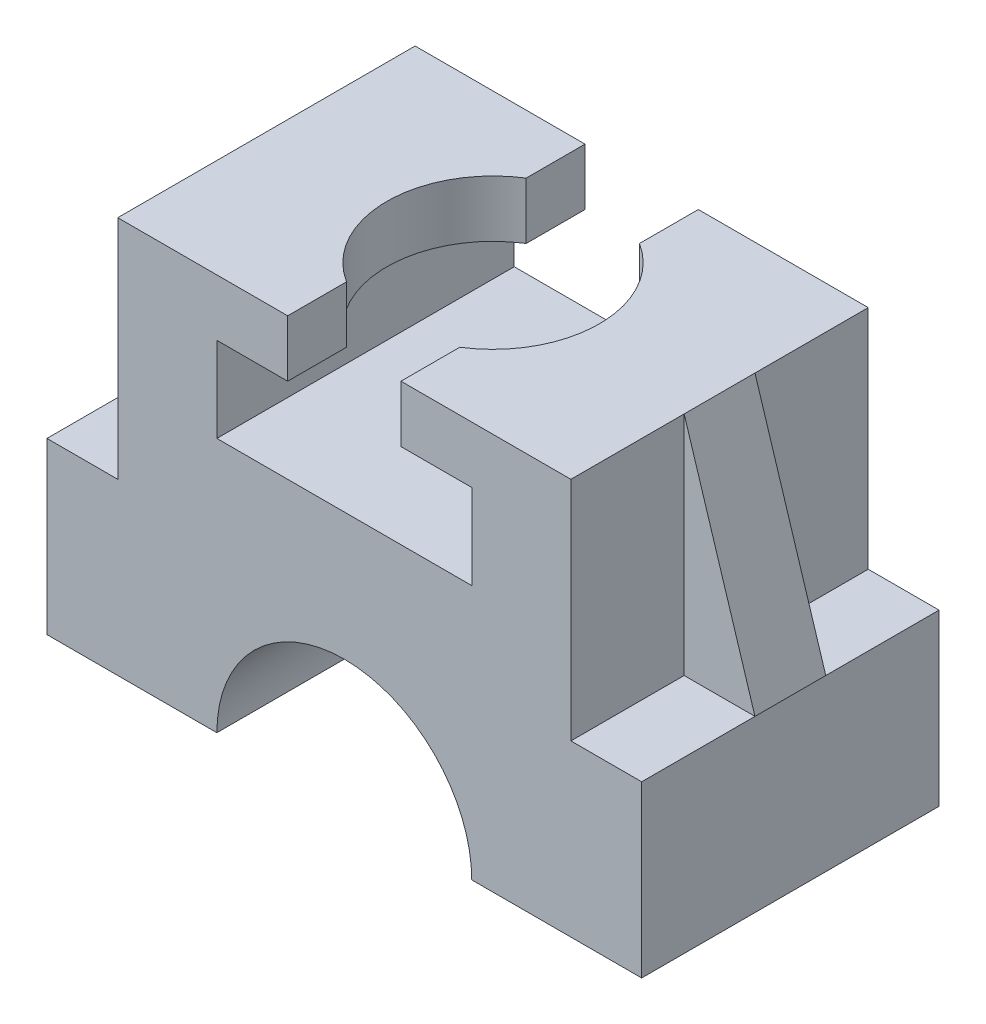
ISO-10303-21;
HEADER;
FILE_DESCRIPTION(('STEP AP214'),'2;1');
FILE_NAME('part.step','',(''),(''),'','','');
FILE_SCHEMA(('AUTOMOTIVE_DESIGN { 1 0 10303 214 1 1 1 1 }'));
ENDSEC;
DATA;
#1=APPLICATION_CONTEXT('core data for automotive mechanical design processes');
#2=APPLICATION_PROTOCOL_DEFINITION('international standard','automotive_design',2000,#1);
#3=PRODUCT_CONTEXT('',#1,'mechanical');
#4=PRODUCT('Part','Part','',(#3));
#5=PRODUCT_RELATED_PRODUCT_CATEGORY('part','',(#4));
#6=PRODUCT_DEFINITION_FORMATION('','',#4);
#7=PRODUCT_DEFINITION_CONTEXT('part definition',#1,'design');
#8=PRODUCT_DEFINITION('design','',#6,#7);
#9=PRODUCT_DEFINITION_SHAPE('','',#8);
#10=(LENGTH_UNIT() NAMED_UNIT(*) SI_UNIT(.MILLI.,.METRE.));
#11=(NAMED_UNIT(*) PLANE_ANGLE_UNIT() SI_UNIT($,.RADIAN.));
#12=(NAMED_UNIT(*) SI_UNIT($,.STERADIAN.) SOLID_ANGLE_UNIT());
#13=UNCERTAINTY_MEASURE_WITH_UNIT(LENGTH_MEASURE(1.E-05),#10,'distance_accuracy_value','');
#14=(GEOMETRIC_REPRESENTATION_CONTEXT(3) GLOBAL_UNCERTAINTY_ASSIGNED_CONTEXT((#13)) GLOBAL_UNIT_ASSIGNED_CONTEXT((#10,
#11,#12)) REPRESENTATION_CONTEXT('',''));
#15=CARTESIAN_POINT('',(0.,0.,0.));
#16=DIRECTION('',(0.,0.,1.));
#17=DIRECTION('',(1.,0.,0.));
#18=AXIS2_PLACEMENT_3D('',#15,#16,#17);
#19=CARTESIAN_POINT('',(-105.,0.,-105.));
#20=DIRECTION('',(0.,1.,0.));
#21=DIRECTION('',(0.,0.,1.));
#22=AXIS2_PLACEMENT_3D('',#19,#20,#21);
#23=PLANE('',#22);
#24=DIRECTION('',(0.,0.,1.));
#25=VECTOR('',#24,1.);
#26=CARTESIAN_POINT('',(-105.,0.,-105.));
#27=LINE('',#26,#25);
#28=CARTESIAN_POINT('',(-105.,0.,-105.));
#29=VERTEX_POINT('',#28);
#30=CARTESIAN_POINT('',(-105.,0.,-65.));
#31=VERTEX_POINT('',#30);
#32=EDGE_CURVE('E416',#29,#31,#27,.T.);
#33=ORIENTED_EDGE('',*,*,#32,.T.);
#34=DIRECTION('',(1.,0.,0.));
#35=VECTOR('',#34,1.);
#36=CARTESIAN_POINT('',(-105.,0.,-65.));
#37=LINE('',#36,#35);
#38=CARTESIAN_POINT('',(-80.,0.,-65.));
#39=VERTEX_POINT('',#38);
#40=EDGE_CURVE('E566',#31,#39,#37,.T.);
#41=ORIENTED_EDGE('',*,*,#40,.T.);
#42=DIRECTION('',(0.,0.,1.));
#43=VECTOR('',#42,1.);
#44=CARTESIAN_POINT('',(-80.,0.,-105.));
#45=LINE('',#44,#43);
#46=CARTESIAN_POINT('',(-80.,0.,-105.));
#47=VERTEX_POINT('',#46);
#48=EDGE_CURVE('E274',#47,#39,#45,.T.);
#49=ORIENTED_EDGE('',*,*,#48,.F.);
#50=DIRECTION('',(-1.,0.,0.));
#51=VECTOR('',#50,1.);
#52=CARTESIAN_POINT('',(-105.,0.,-105.));
#53=LINE('',#52,#51);
#54=EDGE_CURVE('E551',#47,#29,#53,.T.);
#55=ORIENTED_EDGE('',*,*,#54,.T.);
#56=EDGE_LOOP('',(#33,#41,#49,#55));
#57=FACE_BOUND('',#56,.T.);
#58=ADVANCED_FACE('F43',(#57),#23,.T.);
#59=CARTESIAN_POINT('',(-80.,0.,-40.));
#60=VERTEX_POINT('',#59);
#61=CARTESIAN_POINT('',(-80.,0.,0.));
#62=VERTEX_POINT('',#61);
#63=EDGE_CURVE('E269',#60,#62,#45,.T.);
#64=ORIENTED_EDGE('',*,*,#63,.F.);
#65=DIRECTION('',(1.,0.,0.));
#66=VECTOR('',#65,1.);
#67=CARTESIAN_POINT('',(-105.,0.,-40.));
#68=LINE('',#67,#66);
#69=CARTESIAN_POINT('',(-105.,0.,-40.));
#70=VERTEX_POINT('',#69);
#71=EDGE_CURVE('E255',#70,#60,#68,.T.);
#72=ORIENTED_EDGE('',*,*,#71,.F.);
#73=CARTESIAN_POINT('',(-105.,0.,0.));
#74=VERTEX_POINT('',#73);
#75=EDGE_CURVE('E419',#70,#74,#27,.T.);
#76=ORIENTED_EDGE('',*,*,#75,.T.);
#77=DIRECTION('',(-1.,0.,0.));
#78=VECTOR('',#77,1.);
#79=CARTESIAN_POINT('',(-105.,0.,0.));
#80=LINE('',#79,#78);
#81=EDGE_CURVE('E392',#62,#74,#80,.T.);
#82=ORIENTED_EDGE('',*,*,#81,.F.);
#83=EDGE_LOOP('',(#64,#72,#76,#82));
#84=FACE_BOUND('',#83,.T.);
#85=ADVANCED_FACE('F434',(#84),#23,.T.);
#86=CARTESIAN_POINT('',(-80.,80.,-105.));
#87=DIRECTION('',(-1.,0.,0.));
#88=DIRECTION('',(0.,-1.,0.));
#89=AXIS2_PLACEMENT_3D('',#86,#87,#88);
#90=PLANE('',#89);
#91=ORIENTED_EDGE('',*,*,#48,.T.);
#92=DIRECTION('',(0.,-1.,0.));
#93=VECTOR('',#92,1.);
#94=CARTESIAN_POINT('',(-80.,0.,-65.));
#95=LINE('',#94,#93);
#96=CARTESIAN_POINT('',(-80.,80.,-65.));
#97=VERTEX_POINT('',#96);
#98=EDGE_CURVE('E250',#97,#39,#95,.T.);
#99=ORIENTED_EDGE('',*,*,#98,.F.);
#100=DIRECTION('',(0.,0.,1.));
#101=VECTOR('',#100,1.);
#102=CARTESIAN_POINT('',(-80.,80.,-105.));
#103=LINE('',#102,#101);
#104=CARTESIAN_POINT('',(-80.,80.,-105.));
#105=VERTEX_POINT('',#104);
#106=EDGE_CURVE('E248',#105,#97,#103,.T.);
#107=ORIENTED_EDGE('',*,*,#106,.F.);
#108=DIRECTION('',(0.,-1.,0.));
#109=VECTOR('',#108,1.);
#110=CARTESIAN_POINT('',(-80.,80.,-105.));
#111=LINE('',#110,#109);
#112=EDGE_CURVE('E548',#105,#47,#111,.T.);
#113=ORIENTED_EDGE('',*,*,#112,.T.);
#114=EDGE_LOOP('',(#91,#99,#107,#113));
#115=FACE_BOUND('',#114,.T.);
#116=ADVANCED_FACE('F611',(#115),#90,.T.);
#117=CARTESIAN_POINT('',(-80.,80.,-40.));
#118=VERTEX_POINT('',#117);
#119=CARTESIAN_POINT('',(-80.,80.,0.));
#120=VERTEX_POINT('',#119);
#121=EDGE_CURVE('E245',#118,#120,#103,.T.);
#122=ORIENTED_EDGE('',*,*,#121,.F.);
#123=DIRECTION('',(0.,1.,0.));
#124=VECTOR('',#123,1.);
#125=CARTESIAN_POINT('',(-80.,0.,-40.));
#126=LINE('',#125,#124);
#127=EDGE_CURVE('E253',#60,#118,#126,.T.);
#128=ORIENTED_EDGE('',*,*,#127,.F.);
#129=ORIENTED_EDGE('',*,*,#63,.T.);
#130=DIRECTION('',(0.,-1.,0.));
#131=VECTOR('',#130,1.);
#132=CARTESIAN_POINT('',(-80.,80.,0.));
#133=LINE('',#132,#131);
#134=EDGE_CURVE('E262',#120,#62,#133,.T.);
#135=ORIENTED_EDGE('',*,*,#134,.F.);
#136=EDGE_LOOP('',(#122,#128,#129,#135));
#137=FACE_BOUND('',#136,.T.);
#138=ADVANCED_FACE('F260',(#137),#90,.T.);
#139=CARTESIAN_POINT('',(80.,80.,-105.));
#140=DIRECTION('',(1.,0.,0.));
#141=DIRECTION('',(0.,0.,-1.));
#142=AXIS2_PLACEMENT_3D('',#139,#140,#141);
#143=PLANE('',#142);
#144=DIRECTION('',(0.,0.,1.));
#145=VECTOR('',#144,1.);
#146=CARTESIAN_POINT('',(80.,80.,-105.));
#147=LINE('',#146,#145);
#148=CARTESIAN_POINT('',(80.,80.,-105.));
#149=VERTEX_POINT('',#148);
#150=CARTESIAN_POINT('',(80.,80.,-65.));
#151=VERTEX_POINT('',#150);
#152=EDGE_CURVE('E304',#149,#151,#147,.T.);
#153=ORIENTED_EDGE('',*,*,#152,.T.);
#154=DIRECTION('',(0.,1.,0.));
#155=VECTOR('',#154,1.);
#156=CARTESIAN_POINT('',(80.,0.,-65.));
#157=LINE('',#156,#155);
#158=CARTESIAN_POINT('',(80.,0.,-65.));
#159=VERTEX_POINT('',#158);
#160=EDGE_CURVE('E569',#159,#151,#157,.T.);
#161=ORIENTED_EDGE('',*,*,#160,.F.);
#162=DIRECTION('',(0.,0.,1.));
#163=VECTOR('',#162,1.);
#164=CARTESIAN_POINT('',(80.,0.,-105.));
#165=LINE('',#164,#163);
#166=CARTESIAN_POINT('',(80.,0.,-105.));
#167=VERTEX_POINT('',#166);
#168=EDGE_CURVE('E309',#167,#159,#165,.T.);
#169=ORIENTED_EDGE('',*,*,#168,.F.);
#170=DIRECTION('',(0.,1.,0.));
#171=VECTOR('',#170,1.);
#172=CARTESIAN_POINT('',(80.,80.,-105.));
#173=LINE('',#172,#171);
#174=EDGE_CURVE('E509',#167,#149,#173,.T.);
#175=ORIENTED_EDGE('',*,*,#174,.T.);
#176=EDGE_LOOP('',(#153,#161,#169,#175));
#177=FACE_BOUND('',#176,.T.);
#178=ADVANCED_FACE('F648',(#177),#143,.T.);
#179=CARTESIAN_POINT('',(80.,0.,-40.));
#180=VERTEX_POINT('',#179);
#181=CARTESIAN_POINT('',(80.,0.,0.));
#182=VERTEX_POINT('',#181);
#183=EDGE_CURVE('E313',#180,#182,#165,.T.);
#184=ORIENTED_EDGE('',*,*,#183,.F.);
#185=DIRECTION('',(0.,-1.,0.));
#186=VECTOR('',#185,1.);
#187=CARTESIAN_POINT('',(80.,0.,-40.));
#188=LINE('',#187,#186);
#189=CARTESIAN_POINT('',(80.,80.,-40.));
#190=VERTEX_POINT('',#189);
#191=EDGE_CURVE('E477',#190,#180,#188,.T.);
#192=ORIENTED_EDGE('',*,*,#191,.F.);
#193=CARTESIAN_POINT('',(80.,80.,0.));
#194=VERTEX_POINT('',#193);
#195=EDGE_CURVE('E308',#190,#194,#147,.T.);
#196=ORIENTED_EDGE('',*,*,#195,.T.);
#197=DIRECTION('',(0.,1.,0.));
#198=VECTOR('',#197,1.);
#199=CARTESIAN_POINT('',(80.,80.,0.));
#200=LINE('',#199,#198);
#201=EDGE_CURVE('E351',#182,#194,#200,.T.);
#202=ORIENTED_EDGE('',*,*,#201,.F.);
#203=EDGE_LOOP('',(#184,#192,#196,#202));
#204=FACE_BOUND('',#203,.T.);
#205=ADVANCED_FACE('F459',(#204),#143,.T.);
#206=CARTESIAN_POINT('',(80.,0.,-105.));
#207=DIRECTION('',(0.,1.,0.));
#208=DIRECTION('',(0.,0.,1.));
#209=AXIS2_PLACEMENT_3D('',#206,#207,#208);
#210=PLANE('',#209);
#211=ORIENTED_EDGE('',*,*,#168,.T.);
#212=DIRECTION('',(-1.,0.,0.));
#213=VECTOR('',#212,1.);
#214=CARTESIAN_POINT('',(105.,0.,-65.));
#215=LINE('',#214,#213);
#216=CARTESIAN_POINT('',(105.,0.,-65.));
#217=VERTEX_POINT('',#216);
#218=EDGE_CURVE('E479',#217,#159,#215,.T.);
#219=ORIENTED_EDGE('',*,*,#218,.F.);
#220=DIRECTION('',(0.,0.,1.));
#221=VECTOR('',#220,1.);
#222=CARTESIAN_POINT('',(105.,0.,-105.));
#223=LINE('',#222,#221);
#224=CARTESIAN_POINT('',(105.,0.,-105.));
#225=VERTEX_POINT('',#224);
#226=EDGE_CURVE('E314',#225,#217,#223,.T.);
#227=ORIENTED_EDGE('',*,*,#226,.F.);
#228=DIRECTION('',(-1.,0.,0.));
#229=VECTOR('',#228,1.);
#230=CARTESIAN_POINT('',(80.,0.,-105.));
#231=LINE('',#230,#229);
#232=EDGE_CURVE('E505',#225,#167,#231,.T.);
#233=ORIENTED_EDGE('',*,*,#232,.T.);
#234=EDGE_LOOP('',(#211,#219,#227,#233));
#235=FACE_BOUND('',#234,.T.);
#236=ADVANCED_FACE('F652',(#235),#210,.T.);
#237=CARTESIAN_POINT('',(105.,0.,-40.));
#238=VERTEX_POINT('',#237);
#239=CARTESIAN_POINT('',(105.,0.,0.));
#240=VERTEX_POINT('',#239);
#241=EDGE_CURVE('E317',#238,#240,#223,.T.);
#242=ORIENTED_EDGE('',*,*,#241,.F.);
#243=DIRECTION('',(-1.,0.,0.));
#244=VECTOR('',#243,1.);
#245=CARTESIAN_POINT('',(105.,0.,-40.));
#246=LINE('',#245,#244);
#247=EDGE_CURVE('E456',#238,#180,#246,.T.);
#248=ORIENTED_EDGE('',*,*,#247,.T.);
#249=ORIENTED_EDGE('',*,*,#183,.T.);
#250=DIRECTION('',(-1.,0.,0.));
#251=VECTOR('',#250,1.);
#252=CARTESIAN_POINT('',(80.,0.,0.));
#253=LINE('',#252,#251);
#254=EDGE_CURVE('E347',#240,#182,#253,.T.);
#255=ORIENTED_EDGE('',*,*,#254,.F.);
#256=EDGE_LOOP('',(#242,#248,#249,#255));
#257=FACE_BOUND('',#256,.T.);
#258=ADVANCED_FACE('F454',(#257),#210,.T.);
#259=CARTESIAN_POINT('',(-20.,60.,-105.));
#260=DIRECTION('',(1.,0.,0.));
#261=DIRECTION('',(0.,1.,0.));
#262=AXIS2_PLACEMENT_3D('',#259,#260,#261);
#263=PLANE('',#262);
#264=DIRECTION('',(0.,1.,0.));
#265=VECTOR('',#264,1.);
#266=CARTESIAN_POINT('',(-20.,60.,-84.2214438511238));
#267=LINE('',#266,#265);
#268=CARTESIAN_POINT('',(-20.,60.,-84.2214438511238));
#269=VERTEX_POINT('',#268);
#270=CARTESIAN_POINT('',(-20.,80.,-84.2214438511238));
#271=VERTEX_POINT('',#270);
#272=EDGE_CURVE('E343',#269,#271,#267,.T.);
#273=ORIENTED_EDGE('',*,*,#272,.F.);
#274=DIRECTION('',(0.,0.,1.));
#275=VECTOR('',#274,1.);
#276=CARTESIAN_POINT('',(-20.,60.,-105.));
#277=LINE('',#276,#275);
#278=CARTESIAN_POINT('',(-20.,60.,-105.));
#279=VERTEX_POINT('',#278);
#280=EDGE_CURVE('E277',#279,#269,#277,.T.);
#281=ORIENTED_EDGE('',*,*,#280,.F.);
#282=DIRECTION('',(0.,1.,0.));
#283=VECTOR('',#282,1.);
#284=CARTESIAN_POINT('',(-20.,60.,-105.));
#285=LINE('',#284,#283);
#286=CARTESIAN_POINT('',(-20.,80.,-105.));
#287=VERTEX_POINT('',#286);
#288=EDGE_CURVE('E541',#279,#287,#285,.T.);
#289=ORIENTED_EDGE('',*,*,#288,.T.);
#290=DIRECTION('',(0.,0.,1.));
#291=VECTOR('',#290,1.);
#292=CARTESIAN_POINT('',(-20.,80.,-105.));
#293=LINE('',#292,#291);
#294=EDGE_CURVE('E265',#287,#271,#293,.T.);
#295=ORIENTED_EDGE('',*,*,#294,.T.);
#296=EDGE_LOOP('',(#273,#281,#289,#295));
#297=FACE_BOUND('',#296,.T.);
#298=ADVANCED_FACE('F602',(#297),#263,.T.);
#299=CARTESIAN_POINT('',(20.,60.,-105.));
#300=DIRECTION('',(-1.,0.,0.));
#301=DIRECTION('',(0.,-1.,0.));
#302=AXIS2_PLACEMENT_3D('',#299,#300,#301);
#303=PLANE('',#302);
#304=DIRECTION('',(0.,1.,0.));
#305=VECTOR('',#304,1.);
#306=CARTESIAN_POINT('',(20.,60.,-20.7785561488762));
#307=LINE('',#306,#305);
#308=CARTESIAN_POINT('',(20.,60.,-20.7785561488762));
#309=VERTEX_POINT('',#308);
#310=CARTESIAN_POINT('',(20.,80.,-20.7785561488762));
#311=VERTEX_POINT('',#310);
#312=EDGE_CURVE('E66',#309,#311,#307,.T.);
#313=ORIENTED_EDGE('',*,*,#312,.F.);
#314=DIRECTION('',(0.,0.,1.));
#315=VECTOR('',#314,1.);
#316=CARTESIAN_POINT('',(20.,60.,-105.));
#317=LINE('',#316,#315);
#318=CARTESIAN_POINT('',(20.,60.,0.));
#319=VERTEX_POINT('',#318);
#320=EDGE_CURVE('E298',#309,#319,#317,.T.);
#321=ORIENTED_EDGE('',*,*,#320,.T.);
#322=DIRECTION('',(0.,-1.,0.));
#323=VECTOR('',#322,1.);
#324=CARTESIAN_POINT('',(20.,60.,0.));
#325=LINE('',#324,#323);
#326=CARTESIAN_POINT('',(20.,80.,0.));
#327=VERTEX_POINT('',#326);
#328=EDGE_CURVE('E359',#327,#319,#325,.T.);
#329=ORIENTED_EDGE('',*,*,#328,.F.);
#330=DIRECTION('',(0.,0.,1.));
#331=VECTOR('',#330,1.);
#332=CARTESIAN_POINT('',(20.,80.,-105.));
#333=LINE('',#332,#331);
#334=EDGE_CURVE('E303',#311,#327,#333,.T.);
#335=ORIENTED_EDGE('',*,*,#334,.F.);
#336=EDGE_LOOP('',(#313,#321,#329,#335));
#337=FACE_BOUND('',#336,.T.);
#338=ADVANCED_FACE('F595',(#337),#303,.T.);
#339=CARTESIAN_POINT('',(45.,-60.,-105.));
#340=DIRECTION('',(0.,-1.,0.));
#341=DIRECTION('',(0.,0.,-1.));
#342=AXIS2_PLACEMENT_3D('',#339,#340,#341);
#343=PLANE('',#342);
#344=DIRECTION('',(1.,0.,0.));
#345=VECTOR('',#344,1.);
#346=CARTESIAN_POINT('',(45.,-60.,0.));
#347=LINE('',#346,#345);
#348=CARTESIAN_POINT('',(45.,-60.,0.));
#349=VERTEX_POINT('',#348);
#350=CARTESIAN_POINT('',(105.,-60.,0.));
#351=VERTEX_POINT('',#350);
#352=EDGE_CURVE('E338',#349,#351,#347,.T.);
#353=ORIENTED_EDGE('',*,*,#352,.F.);
#354=DIRECTION('',(0.,0.,1.));
#355=VECTOR('',#354,1.);
#356=CARTESIAN_POINT('',(45.,-60.,-105.));
#357=LINE('',#356,#355);
#358=CARTESIAN_POINT('',(45.,-60.,-105.));
#359=VERTEX_POINT('',#358);
#360=EDGE_CURVE('E52',#359,#349,#357,.T.);
#361=ORIENTED_EDGE('',*,*,#360,.F.);
#362=DIRECTION('',(1.,0.,0.));
#363=VECTOR('',#362,1.);
#364=CARTESIAN_POINT('',(45.,-60.,-105.));
#365=LINE('',#364,#363);
#366=CARTESIAN_POINT('',(105.,-60.,-105.));
#367=VERTEX_POINT('',#366);
#368=EDGE_CURVE('E408',#359,#367,#365,.T.);
#369=ORIENTED_EDGE('',*,*,#368,.T.);
#370=DIRECTION('',(0.,0.,1.));
#371=VECTOR('',#370,1.);
#372=CARTESIAN_POINT('',(105.,-60.,-105.));
#373=LINE('',#372,#371);
#374=EDGE_CURVE('E318',#367,#351,#373,.T.);
#375=ORIENTED_EDGE('',*,*,#374,.T.);
#376=EDGE_LOOP('',(#353,#361,#369,#375));
#377=FACE_BOUND('',#376,.T.);
#378=ADVANCED_FACE('F45',(#377),#343,.T.);
#379=CARTESIAN_POINT('',(0.,-60.,-105.));
#380=DIRECTION('',(0.,0.,1.));
#381=DIRECTION('',(1.,0.,0.));
#382=AXIS2_PLACEMENT_3D('',#379,#380,#381);
#383=CYLINDRICAL_SURFACE('',#382,45.);
#384=CARTESIAN_POINT('',(0.,-60.,0.));
#385=DIRECTION('',(0.,0.,-1.));
#386=DIRECTION('',(1.,0.,0.));
#387=AXIS2_PLACEMENT_3D('',#384,#385,#386);
#388=CIRCLE('',#387,45.);
#389=CARTESIAN_POINT('',(-45.,-60.,0.));
#390=VERTEX_POINT('',#389);
#391=EDGE_CURVE('E404',#390,#349,#388,.T.);
#392=ORIENTED_EDGE('',*,*,#391,.F.);
#393=DIRECTION('',(0.,0.,1.));
#394=VECTOR('',#393,1.);
#395=CARTESIAN_POINT('',(-45.,-60.,-105.));
#396=LINE('',#395,#394);
#397=CARTESIAN_POINT('',(-45.,-60.,-105.));
#398=VERTEX_POINT('',#397);
#399=EDGE_CURVE('E411',#398,#390,#396,.T.);
#400=ORIENTED_EDGE('',*,*,#399,.F.);
#401=CARTESIAN_POINT('',(0.,-60.,-105.));
#402=DIRECTION('',(0.,0.,-1.));
#403=DIRECTION('',(1.,0.,0.));
#404=AXIS2_PLACEMENT_3D('',#401,#402,#403);
#405=CIRCLE('',#404,45.);
#406=EDGE_CURVE('E320',#398,#359,#405,.T.);
#407=ORIENTED_EDGE('',*,*,#406,.T.);
#408=ORIENTED_EDGE('',*,*,#360,.T.);
#409=EDGE_LOOP('',(#392,#400,#407,#408));
#410=FACE_BOUND('',#409,.T.);
#411=ADVANCED_FACE('F593',(#410),#383,.F.);
#412=CARTESIAN_POINT('',(-105.,-60.,-105.));
#413=DIRECTION('',(0.,-1.,0.));
#414=DIRECTION('',(1.,0.,0.));
#415=AXIS2_PLACEMENT_3D('',#412,#413,#414);
#416=PLANE('',#415);
#417=DIRECTION('',(1.,0.,0.));
#418=VECTOR('',#417,1.);
#419=CARTESIAN_POINT('',(-105.,-60.,0.));
#420=LINE('',#419,#418);
#421=CARTESIAN_POINT('',(-105.,-60.,0.));
#422=VERTEX_POINT('',#421);
#423=EDGE_CURVE('E400',#422,#390,#420,.T.);
#424=ORIENTED_EDGE('',*,*,#423,.F.);
#425=DIRECTION('',(0.,0.,1.));
#426=VECTOR('',#425,1.);
#427=CARTESIAN_POINT('',(-105.,-60.,-105.));
#428=LINE('',#427,#426);
#429=CARTESIAN_POINT('',(-105.,-60.,-105.));
#430=VERTEX_POINT('',#429);
#431=EDGE_CURVE('E414',#430,#422,#428,.T.);
#432=ORIENTED_EDGE('',*,*,#431,.F.);
#433=DIRECTION('',(1.,0.,0.));
#434=VECTOR('',#433,1.);
#435=CARTESIAN_POINT('',(-105.,-60.,-105.));
#436=LINE('',#435,#434);
#437=EDGE_CURVE('E328',#430,#398,#436,.T.);
#438=ORIENTED_EDGE('',*,*,#437,.T.);
#439=ORIENTED_EDGE('',*,*,#399,.T.);
#440=EDGE_LOOP('',(#424,#432,#438,#439));
#441=FACE_BOUND('',#440,.T.);
#442=ADVANCED_FACE('F600',(#441),#416,.T.);
#443=CARTESIAN_POINT('',(-105.,0.,-105.));
#444=DIRECTION('',(-1.,0.,0.));
#445=DIRECTION('',(0.,0.,1.));
#446=AXIS2_PLACEMENT_3D('',#443,#444,#445);
#447=PLANE('',#446);
#448=DIRECTION('',(0.,0.,-1.));
#449=VECTOR('',#448,1.);
#450=CARTESIAN_POINT('',(-105.,0.,-40.));
#451=LINE('',#450,#449);
#452=EDGE_CURVE('E233',#70,#31,#451,.T.);
#453=ORIENTED_EDGE('',*,*,#452,.T.);
#454=ORIENTED_EDGE('',*,*,#32,.F.);
#455=DIRECTION('',(0.,-1.,0.));
#456=VECTOR('',#455,1.);
#457=CARTESIAN_POINT('',(-105.,0.,-105.));
#458=LINE('',#457,#456);
#459=EDGE_CURVE('E334',#29,#430,#458,.T.);
#460=ORIENTED_EDGE('',*,*,#459,.T.);
#461=ORIENTED_EDGE('',*,*,#431,.T.);
#462=DIRECTION('',(0.,-1.,0.));
#463=VECTOR('',#462,1.);
#464=CARTESIAN_POINT('',(-105.,0.,0.));
#465=LINE('',#464,#463);
#466=EDGE_CURVE('E396',#74,#422,#465,.T.);
#467=ORIENTED_EDGE('',*,*,#466,.F.);
#468=ORIENTED_EDGE('',*,*,#75,.F.);
#469=EDGE_LOOP('',(#453,#454,#460,#461,#467,#468));
#470=FACE_BOUND('',#469,.T.);
#471=ADVANCED_FACE('F557',(#470),#447,.T.);
#472=CARTESIAN_POINT('',(-80.,80.,-105.));
#473=DIRECTION('',(0.,1.,0.));
#474=DIRECTION('',(-1.,0.,0.));
#475=AXIS2_PLACEMENT_3D('',#472,#473,#474);
#476=PLANE('',#475);
#477=DIRECTION('',(0.,0.,-1.));
#478=VECTOR('',#477,1.);
#479=CARTESIAN_POINT('',(-80.,80.,-40.));
#480=LINE('',#479,#478);
#481=EDGE_CURVE('E230',#118,#97,#480,.T.);
#482=ORIENTED_EDGE('',*,*,#481,.F.);
#483=ORIENTED_EDGE('',*,*,#121,.T.);
#484=DIRECTION('',(-1.,0.,0.));
#485=VECTOR('',#484,1.);
#486=CARTESIAN_POINT('',(-80.,80.,0.));
#487=LINE('',#486,#485);
#488=CARTESIAN_POINT('',(-20.,80.,0.));
#489=VERTEX_POINT('',#488);
#490=EDGE_CURVE('E387',#489,#120,#487,.T.);
#491=ORIENTED_EDGE('',*,*,#490,.F.);
#492=CARTESIAN_POINT('',(-20.,80.,-20.7785561488762));
#493=VERTEX_POINT('',#492);
#494=EDGE_CURVE('E271',#493,#489,#293,.T.);
#495=ORIENTED_EDGE('',*,*,#494,.F.);
#496=CARTESIAN_POINT('',(0.,80.,-52.5));
#497=DIRECTION('',(0.,1.,0.));
#498=DIRECTION('',(-1.,0.,0.));
#499=AXIS2_PLACEMENT_3D('',#496,#497,#498);
#500=CIRCLE('',#499,37.5);
#501=EDGE_CURVE('E440',#271,#493,#500,.T.);
#502=ORIENTED_EDGE('',*,*,#501,.F.);
#503=ORIENTED_EDGE('',*,*,#294,.F.);
#504=DIRECTION('',(-1.,0.,0.));
#505=VECTOR('',#504,1.);
#506=CARTESIAN_POINT('',(-80.,80.,-105.));
#507=LINE('',#506,#505);
#508=EDGE_CURVE('E545',#287,#105,#507,.T.);
#509=ORIENTED_EDGE('',*,*,#508,.T.);
#510=ORIENTED_EDGE('',*,*,#106,.T.);
#511=EDGE_LOOP('',(#482,#483,#491,#495,#502,#503,#509,#510));
#512=FACE_BOUND('',#511,.T.);
#513=ADVANCED_FACE('F242',(#512),#476,.T.);
#514=DIRECTION('',(0.,1.,0.));
#515=VECTOR('',#514,1.);
#516=CARTESIAN_POINT('',(-20.,60.,-20.7785561488762));
#517=LINE('',#516,#515);
#518=CARTESIAN_POINT('',(-20.,60.,-20.7785561488762));
#519=VERTEX_POINT('',#518);
#520=EDGE_CURVE('E59',#493,#519,#517,.F.);
#521=ORIENTED_EDGE('',*,*,#520,.F.);
#522=ORIENTED_EDGE('',*,*,#494,.T.);
#523=DIRECTION('',(0.,1.,0.));
#524=VECTOR('',#523,1.);
#525=CARTESIAN_POINT('',(-20.,60.,0.));
#526=LINE('',#525,#524);
#527=CARTESIAN_POINT('',(-20.,60.,0.));
#528=VERTEX_POINT('',#527);
#529=EDGE_CURVE('E383',#528,#489,#526,.T.);
#530=ORIENTED_EDGE('',*,*,#529,.F.);
#531=EDGE_CURVE('E281',#519,#528,#277,.T.);
#532=ORIENTED_EDGE('',*,*,#531,.F.);
#533=EDGE_LOOP('',(#521,#522,#530,#532));
#534=FACE_BOUND('',#533,.T.);
#535=ADVANCED_FACE('F619',(#534),#263,.T.);
#536=CARTESIAN_POINT('',(-45.,60.,-105.));
#537=DIRECTION('',(0.,-1.,0.));
#538=DIRECTION('',(0.,0.,-1.));
#539=AXIS2_PLACEMENT_3D('',#536,#537,#538);
#540=PLANE('',#539);
#541=CARTESIAN_POINT('',(0.,60.,-52.5));
#542=DIRECTION('',(0.,1.,0.));
#543=DIRECTION('',(-1.,0.,0.));
#544=AXIS2_PLACEMENT_3D('',#541,#542,#543);
#545=CIRCLE('',#544,37.5);
#546=EDGE_CURVE('E483',#269,#519,#545,.T.);
#547=ORIENTED_EDGE('',*,*,#546,.T.);
#548=ORIENTED_EDGE('',*,*,#531,.T.);
#549=DIRECTION('',(1.,0.,0.));
#550=VECTOR('',#549,1.);
#551=CARTESIAN_POINT('',(-45.,60.,0.));
#552=LINE('',#551,#550);
#553=CARTESIAN_POINT('',(-45.,60.,0.));
#554=VERTEX_POINT('',#553);
#555=EDGE_CURVE('E379',#554,#528,#552,.T.);
#556=ORIENTED_EDGE('',*,*,#555,.F.);
#557=DIRECTION('',(0.,0.,1.));
#558=VECTOR('',#557,1.);
#559=CARTESIAN_POINT('',(-45.,60.,-105.));
#560=LINE('',#559,#558);
#561=CARTESIAN_POINT('',(-45.,60.,-105.));
#562=VERTEX_POINT('',#561);
#563=EDGE_CURVE('E282',#562,#554,#560,.T.);
#564=ORIENTED_EDGE('',*,*,#563,.F.);
#565=DIRECTION('',(1.,0.,0.));
#566=VECTOR('',#565,1.);
#567=CARTESIAN_POINT('',(-45.,60.,-105.));
#568=LINE('',#567,#566);
#569=EDGE_CURVE('E537',#562,#279,#568,.T.);
#570=ORIENTED_EDGE('',*,*,#569,.T.);
#571=ORIENTED_EDGE('',*,*,#280,.T.);
#572=EDGE_LOOP('',(#547,#548,#556,#564,#570,#571));
#573=FACE_BOUND('',#572,.T.);
#574=ADVANCED_FACE('F622',(#573),#540,.T.);
#575=CARTESIAN_POINT('',(-45.,30.,-105.));
#576=DIRECTION('',(1.,0.,0.));
#577=DIRECTION('',(0.,0.,-1.));
#578=AXIS2_PLACEMENT_3D('',#575,#576,#577);
#579=PLANE('',#578);
#580=DIRECTION('',(0.,1.,0.));
#581=VECTOR('',#580,1.);
#582=CARTESIAN_POINT('',(-45.,30.,0.));
#583=LINE('',#582,#581);
#584=CARTESIAN_POINT('',(-45.,30.,0.));
#585=VERTEX_POINT('',#584);
#586=EDGE_CURVE('E375',#585,#554,#583,.T.);
#587=ORIENTED_EDGE('',*,*,#586,.F.);
#588=DIRECTION('',(0.,0.,1.));
#589=VECTOR('',#588,1.);
#590=CARTESIAN_POINT('',(-45.,30.,-105.));
#591=LINE('',#590,#589);
#592=CARTESIAN_POINT('',(-45.,30.,-105.));
#593=VERTEX_POINT('',#592);
#594=EDGE_CURVE('E285',#593,#585,#591,.T.);
#595=ORIENTED_EDGE('',*,*,#594,.F.);
#596=DIRECTION('',(0.,1.,0.));
#597=VECTOR('',#596,1.);
#598=CARTESIAN_POINT('',(-45.,30.,-105.));
#599=LINE('',#598,#597);
#600=EDGE_CURVE('E533',#593,#562,#599,.T.);
#601=ORIENTED_EDGE('',*,*,#600,.T.);
#602=ORIENTED_EDGE('',*,*,#563,.T.);
#603=EDGE_LOOP('',(#587,#595,#601,#602));
#604=FACE_BOUND('',#603,.T.);
#605=ADVANCED_FACE('F625',(#604),#579,.T.);
#606=CARTESIAN_POINT('',(-45.,30.,-105.));
#607=DIRECTION('',(0.,1.,0.));
#608=DIRECTION('',(-1.,0.,0.));
#609=AXIS2_PLACEMENT_3D('',#606,#607,#608);
#610=PLANE('',#609);
#611=DIRECTION('',(-1.,0.,0.));
#612=VECTOR('',#611,1.);
#613=CARTESIAN_POINT('',(-45.,30.,0.));
#614=LINE('',#613,#612);
#615=CARTESIAN_POINT('',(45.,30.,0.));
#616=VERTEX_POINT('',#615);
#617=EDGE_CURVE('E371',#616,#585,#614,.T.);
#618=ORIENTED_EDGE('',*,*,#617,.F.);
#619=DIRECTION('',(0.,0.,1.));
#620=VECTOR('',#619,1.);
#621=CARTESIAN_POINT('',(45.,30.,-105.));
#622=LINE('',#621,#620);
#623=CARTESIAN_POINT('',(45.,30.,-105.));
#624=VERTEX_POINT('',#623);
#625=EDGE_CURVE('E288',#624,#616,#622,.T.);
#626=ORIENTED_EDGE('',*,*,#625,.F.);
#627=DIRECTION('',(-1.,0.,0.));
#628=VECTOR('',#627,1.);
#629=CARTESIAN_POINT('',(-45.,30.,-105.));
#630=LINE('',#629,#628);
#631=EDGE_CURVE('E529',#624,#593,#630,.T.);
#632=ORIENTED_EDGE('',*,*,#631,.T.);
#633=ORIENTED_EDGE('',*,*,#594,.T.);
#634=EDGE_LOOP('',(#618,#626,#632,#633));
#635=FACE_BOUND('',#634,.T.);
#636=ADVANCED_FACE('F629',(#635),#610,.T.);
#637=CARTESIAN_POINT('',(45.,30.,-105.));
#638=DIRECTION('',(-1.,0.,0.));
#639=DIRECTION('',(0.,0.,1.));
#640=AXIS2_PLACEMENT_3D('',#637,#638,#639);
#641=PLANE('',#640);
#642=DIRECTION('',(0.,-1.,0.));
#643=VECTOR('',#642,1.);
#644=CARTESIAN_POINT('',(45.,30.,0.));
#645=LINE('',#644,#643);
#646=CARTESIAN_POINT('',(45.,60.,0.));
#647=VERTEX_POINT('',#646);
#648=EDGE_CURVE('E367',#647,#616,#645,.T.);
#649=ORIENTED_EDGE('',*,*,#648,.F.);
#650=DIRECTION('',(0.,0.,1.));
#651=VECTOR('',#650,1.);
#652=CARTESIAN_POINT('',(45.,60.,-105.));
#653=LINE('',#652,#651);
#654=CARTESIAN_POINT('',(45.,60.,-105.));
#655=VERTEX_POINT('',#654);
#656=EDGE_CURVE('E291',#655,#647,#653,.T.);
#657=ORIENTED_EDGE('',*,*,#656,.F.);
#658=DIRECTION('',(0.,-1.,0.));
#659=VECTOR('',#658,1.);
#660=CARTESIAN_POINT('',(45.,30.,-105.));
#661=LINE('',#660,#659);
#662=EDGE_CURVE('E525',#655,#624,#661,.T.);
#663=ORIENTED_EDGE('',*,*,#662,.T.);
#664=ORIENTED_EDGE('',*,*,#625,.T.);
#665=EDGE_LOOP('',(#649,#657,#663,#664));
#666=FACE_BOUND('',#665,.T.);
#667=ADVANCED_FACE('F633',(#666),#641,.T.);
#668=CARTESIAN_POINT('',(20.,60.,-105.));
#669=DIRECTION('',(0.,-1.,0.));
#670=DIRECTION('',(0.,0.,-1.));
#671=AXIS2_PLACEMENT_3D('',#668,#669,#670);
#672=PLANE('',#671);
#673=CARTESIAN_POINT('',(20.,60.,-84.2214438511238));
#674=VERTEX_POINT('',#673);
#675=EDGE_CURVE('E489',#309,#674,#545,.T.);
#676=ORIENTED_EDGE('',*,*,#675,.T.);
#677=CARTESIAN_POINT('',(20.,60.,-105.));
#678=VERTEX_POINT('',#677);
#679=EDGE_CURVE('E294',#678,#674,#317,.T.);
#680=ORIENTED_EDGE('',*,*,#679,.F.);
#681=DIRECTION('',(1.,0.,0.));
#682=VECTOR('',#681,1.);
#683=CARTESIAN_POINT('',(20.,60.,-105.));
#684=LINE('',#683,#682);
#685=EDGE_CURVE('E521',#678,#655,#684,.T.);
#686=ORIENTED_EDGE('',*,*,#685,.T.);
#687=ORIENTED_EDGE('',*,*,#656,.T.);
#688=DIRECTION('',(1.,0.,0.));
#689=VECTOR('',#688,1.);
#690=CARTESIAN_POINT('',(20.,60.,0.));
#691=LINE('',#690,#689);
#692=EDGE_CURVE('E363',#319,#647,#691,.T.);
#693=ORIENTED_EDGE('',*,*,#692,.F.);
#694=ORIENTED_EDGE('',*,*,#320,.F.);
#695=EDGE_LOOP('',(#676,#680,#686,#687,#693,#694));
#696=FACE_BOUND('',#695,.T.);
#697=ADVANCED_FACE('F637',(#696),#672,.T.);
#698=DIRECTION('',(0.,1.,0.));
#699=VECTOR('',#698,1.);
#700=CARTESIAN_POINT('',(20.,60.,-84.2214438511238));
#701=LINE('',#700,#699);
#702=CARTESIAN_POINT('',(20.,80.,-84.2214438511238));
#703=VERTEX_POINT('',#702);
#704=EDGE_CURVE('E491',#703,#674,#701,.F.);
#705=ORIENTED_EDGE('',*,*,#704,.F.);
#706=CARTESIAN_POINT('',(20.,80.,-105.));
#707=VERTEX_POINT('',#706);
#708=EDGE_CURVE('E299',#707,#703,#333,.T.);
#709=ORIENTED_EDGE('',*,*,#708,.F.);
#710=DIRECTION('',(0.,-1.,0.));
#711=VECTOR('',#710,1.);
#712=CARTESIAN_POINT('',(20.,60.,-105.));
#713=LINE('',#712,#711);
#714=EDGE_CURVE('E517',#707,#678,#713,.T.);
#715=ORIENTED_EDGE('',*,*,#714,.T.);
#716=ORIENTED_EDGE('',*,*,#679,.T.);
#717=EDGE_LOOP('',(#705,#709,#715,#716));
#718=FACE_BOUND('',#717,.T.);
#719=ADVANCED_FACE('F605',(#718),#303,.T.);
#720=CARTESIAN_POINT('',(20.,80.,-105.));
#721=DIRECTION('',(0.,1.,0.));
#722=DIRECTION('',(-1.,0.,0.));
#723=AXIS2_PLACEMENT_3D('',#720,#721,#722);
#724=PLANE('',#723);
#725=DIRECTION('',(0.,0.,-1.));
#726=VECTOR('',#725,1.);
#727=CARTESIAN_POINT('',(80.,80.,-40.));
#728=LINE('',#727,#726);
#729=EDGE_CURVE('E471',#190,#151,#728,.T.);
#730=ORIENTED_EDGE('',*,*,#729,.T.);
#731=ORIENTED_EDGE('',*,*,#152,.F.);
#732=DIRECTION('',(-1.,0.,0.));
#733=VECTOR('',#732,1.);
#734=CARTESIAN_POINT('',(20.,80.,-105.));
#735=LINE('',#734,#733);
#736=EDGE_CURVE('E513',#149,#707,#735,.T.);
#737=ORIENTED_EDGE('',*,*,#736,.T.);
#738=ORIENTED_EDGE('',*,*,#708,.T.);
#739=CARTESIAN_POINT('',(0.,80.,-52.5));
#740=DIRECTION('',(0.,1.,0.));
#741=DIRECTION('',(-1.,0.,0.));
#742=AXIS2_PLACEMENT_3D('',#739,#740,#741);
#743=CIRCLE('',#742,37.5);
#744=EDGE_CURVE('E11',#311,#703,#743,.T.);
#745=ORIENTED_EDGE('',*,*,#744,.F.);
#746=ORIENTED_EDGE('',*,*,#334,.T.);
#747=DIRECTION('',(-1.,0.,0.));
#748=VECTOR('',#747,1.);
#749=CARTESIAN_POINT('',(20.,80.,0.));
#750=LINE('',#749,#748);
#751=EDGE_CURVE('E355',#194,#327,#750,.T.);
#752=ORIENTED_EDGE('',*,*,#751,.F.);
#753=ORIENTED_EDGE('',*,*,#195,.F.);
#754=EDGE_LOOP('',(#730,#731,#737,#738,#745,#746,#752,#753));
#755=FACE_BOUND('',#754,.T.);
#756=ADVANCED_FACE('F643',(#755),#724,.T.);
#757=CARTESIAN_POINT('',(105.,0.,-105.));
#758=DIRECTION('',(1.,0.,0.));
#759=DIRECTION('',(0.,1.,0.));
#760=AXIS2_PLACEMENT_3D('',#757,#758,#759);
#761=PLANE('',#760);
#762=DIRECTION('',(0.,0.,-1.));
#763=VECTOR('',#762,1.);
#764=CARTESIAN_POINT('',(105.,0.,-40.));
#765=LINE('',#764,#763);
#766=EDGE_CURVE('E467',#238,#217,#765,.T.);
#767=ORIENTED_EDGE('',*,*,#766,.F.);
#768=ORIENTED_EDGE('',*,*,#241,.T.);
#769=DIRECTION('',(0.,1.,0.));
#770=VECTOR('',#769,1.);
#771=CARTESIAN_POINT('',(105.,0.,0.));
#772=LINE('',#771,#770);
#773=EDGE_CURVE('E342',#351,#240,#772,.T.);
#774=ORIENTED_EDGE('',*,*,#773,.F.);
#775=ORIENTED_EDGE('',*,*,#374,.F.);
#776=DIRECTION('',(0.,1.,0.));
#777=VECTOR('',#776,1.);
#778=CARTESIAN_POINT('',(105.,0.,-105.));
#779=LINE('',#778,#777);
#780=EDGE_CURVE('E502',#367,#225,#779,.T.);
#781=ORIENTED_EDGE('',*,*,#780,.T.);
#782=ORIENTED_EDGE('',*,*,#226,.T.);
#783=EDGE_LOOP('',(#767,#768,#774,#775,#781,#782));
#784=FACE_BOUND('',#783,.T.);
#785=ADVANCED_FACE('F464',(#784),#761,.T.);
#786=CARTESIAN_POINT('',(0.,-60.,-105.));
#787=DIRECTION('',(0.,0.,1.));
#788=DIRECTION('',(1.,0.,0.));
#789=AXIS2_PLACEMENT_3D('',#786,#787,#788);
#790=PLANE('',#789);
#791=ORIENTED_EDGE('',*,*,#368,.F.);
#792=ORIENTED_EDGE('',*,*,#406,.F.);
#793=ORIENTED_EDGE('',*,*,#437,.F.);
#794=ORIENTED_EDGE('',*,*,#459,.F.);
#795=ORIENTED_EDGE('',*,*,#54,.F.);
#796=ORIENTED_EDGE('',*,*,#112,.F.);
#797=ORIENTED_EDGE('',*,*,#508,.F.);
#798=ORIENTED_EDGE('',*,*,#288,.F.);
#799=ORIENTED_EDGE('',*,*,#569,.F.);
#800=ORIENTED_EDGE('',*,*,#600,.F.);
#801=ORIENTED_EDGE('',*,*,#631,.F.);
#802=ORIENTED_EDGE('',*,*,#662,.F.);
#803=ORIENTED_EDGE('',*,*,#685,.F.);
#804=ORIENTED_EDGE('',*,*,#714,.F.);
#805=ORIENTED_EDGE('',*,*,#736,.F.);
#806=ORIENTED_EDGE('',*,*,#174,.F.);
#807=ORIENTED_EDGE('',*,*,#232,.F.);
#808=ORIENTED_EDGE('',*,*,#780,.F.);
#809=EDGE_LOOP('',(#791,#792,#793,#794,#795,#796,#797,#798,#799,#800,#801,#802,#803,#804,#805,
#806,#807,#808));
#810=FACE_BOUND('',#809,.T.);
#811=ADVANCED_FACE('F563',(#810),#790,.F.);
#812=CARTESIAN_POINT('',(0.,-60.,0.));
#813=DIRECTION('',(0.,0.,1.));
#814=DIRECTION('',(1.,0.,0.));
#815=AXIS2_PLACEMENT_3D('',#812,#813,#814);
#816=PLANE('',#815);
#817=ORIENTED_EDGE('',*,*,#352,.T.);
#818=ORIENTED_EDGE('',*,*,#773,.T.);
#819=ORIENTED_EDGE('',*,*,#254,.T.);
#820=ORIENTED_EDGE('',*,*,#201,.T.);
#821=ORIENTED_EDGE('',*,*,#751,.T.);
#822=ORIENTED_EDGE('',*,*,#328,.T.);
#823=ORIENTED_EDGE('',*,*,#692,.T.);
#824=ORIENTED_EDGE('',*,*,#648,.T.);
#825=ORIENTED_EDGE('',*,*,#617,.T.);
#826=ORIENTED_EDGE('',*,*,#586,.T.);
#827=ORIENTED_EDGE('',*,*,#555,.T.);
#828=ORIENTED_EDGE('',*,*,#529,.T.);
#829=ORIENTED_EDGE('',*,*,#490,.T.);
#830=ORIENTED_EDGE('',*,*,#134,.T.);
#831=ORIENTED_EDGE('',*,*,#81,.T.);
#832=ORIENTED_EDGE('',*,*,#466,.T.);
#833=ORIENTED_EDGE('',*,*,#423,.T.);
#834=ORIENTED_EDGE('',*,*,#391,.T.);
#835=EDGE_LOOP('',(#817,#818,#819,#820,#821,#822,#823,#824,#825,#826,#827,#828,#829,#830,#831,
#832,#833,#834));
#836=FACE_BOUND('',#835,.T.);
#837=ADVANCED_FACE('F436',(#836),#816,.T.);
#838=CARTESIAN_POINT('',(0.,60.,-52.5));
#839=DIRECTION('',(0.,1.,0.));
#840=DIRECTION('',(-1.,0.,0.));
#841=AXIS2_PLACEMENT_3D('',#838,#839,#840);
#842=CYLINDRICAL_SURFACE('',#841,37.5);
#843=ORIENTED_EDGE('',*,*,#312,.T.);
#844=ORIENTED_EDGE('',*,*,#744,.T.);
#845=ORIENTED_EDGE('',*,*,#704,.T.);
#846=ORIENTED_EDGE('',*,*,#675,.F.);
#847=EDGE_LOOP('',(#843,#844,#845,#846));
#848=FACE_BOUND('',#847,.T.);
#849=ADVANCED_FACE('F663',(#848),#842,.F.);
#850=ORIENTED_EDGE('',*,*,#272,.T.);
#851=ORIENTED_EDGE('',*,*,#501,.T.);
#852=ORIENTED_EDGE('',*,*,#520,.T.);
#853=ORIENTED_EDGE('',*,*,#546,.F.);
#854=EDGE_LOOP('',(#850,#851,#852,#853));
#855=FACE_BOUND('',#854,.T.);
#856=ADVANCED_FACE('F729',(#855),#842,.F.);
#857=CARTESIAN_POINT('',(105.,0.,-65.));
#858=DIRECTION('',(0.,0.,1.));
#859=DIRECTION('',(1.,0.,0.));
#860=AXIS2_PLACEMENT_3D('',#857,#858,#859);
#861=PLANE('',#860);
#862=ORIENTED_EDGE('',*,*,#160,.T.);
#863=DIRECTION('',(-0.298274993135946,0.95447997803503,0.));
#864=VECTOR('',#863,1.);
#865=CARTESIAN_POINT('',(80.,80.,-65.));
#866=LINE('',#865,#864);
#867=EDGE_CURVE('E582',#217,#151,#866,.T.);
#868=ORIENTED_EDGE('',*,*,#867,.F.);
#869=ORIENTED_EDGE('',*,*,#218,.T.);
#870=EDGE_LOOP('',(#862,#868,#869));
#871=FACE_BOUND('',#870,.T.);
#872=ADVANCED_FACE('F725',(#871),#861,.F.);
#873=CARTESIAN_POINT('',(105.,0.,-40.));
#874=DIRECTION('',(0.,0.,-1.));
#875=DIRECTION('',(-1.,0.,0.));
#876=AXIS2_PLACEMENT_3D('',#873,#874,#875);
#877=PLANE('',#876);
#878=ORIENTED_EDGE('',*,*,#247,.F.);
#879=DIRECTION('',(-0.298274993135946,0.95447997803503,0.));
#880=VECTOR('',#879,1.);
#881=CARTESIAN_POINT('',(80.,80.,-40.));
#882=LINE('',#881,#880);
#883=EDGE_CURVE('E476',#238,#190,#882,.T.);
#884=ORIENTED_EDGE('',*,*,#883,.T.);
#885=ORIENTED_EDGE('',*,*,#191,.T.);
#886=EDGE_LOOP('',(#878,#884,#885));
#887=FACE_BOUND('',#886,.T.);
#888=ADVANCED_FACE('F475',(#887),#877,.F.);
#889=CARTESIAN_POINT('',(-105.,0.,-65.));
#890=DIRECTION('',(0.,0.,1.));
#891=DIRECTION('',(1.,0.,0.));
#892=AXIS2_PLACEMENT_3D('',#889,#890,#891);
#893=PLANE('',#892);
#894=ORIENTED_EDGE('',*,*,#40,.F.);
#895=DIRECTION('',(-0.298274993135947,-0.95447997803503,0.));
#896=VECTOR('',#895,1.);
#897=CARTESIAN_POINT('',(-105.,0.,-65.));
#898=LINE('',#897,#896);
#899=EDGE_CURVE('E238',#97,#31,#898,.T.);
#900=ORIENTED_EDGE('',*,*,#899,.F.);
#901=ORIENTED_EDGE('',*,*,#98,.T.);
#902=EDGE_LOOP('',(#894,#900,#901));
#903=FACE_BOUND('',#902,.T.);
#904=ADVANCED_FACE('F740',(#903),#893,.F.);
#905=CARTESIAN_POINT('',(-105.,0.,-40.));
#906=DIRECTION('',(0.,0.,-1.));
#907=DIRECTION('',(0.,1.,0.));
#908=AXIS2_PLACEMENT_3D('',#905,#906,#907);
#909=PLANE('',#908);
#910=ORIENTED_EDGE('',*,*,#127,.T.);
#911=DIRECTION('',(-0.298274993135947,-0.95447997803503,0.));
#912=VECTOR('',#911,1.);
#913=CARTESIAN_POINT('',(-105.,0.,-40.));
#914=LINE('',#913,#912);
#915=EDGE_CURVE('E227',#118,#70,#914,.T.);
#916=ORIENTED_EDGE('',*,*,#915,.T.);
#917=ORIENTED_EDGE('',*,*,#71,.T.);
#918=EDGE_LOOP('',(#910,#916,#917));
#919=FACE_BOUND('',#918,.T.);
#920=ADVANCED_FACE('F254',(#919),#909,.F.);
#921=CARTESIAN_POINT('',(-105.,0.,-40.));
#922=DIRECTION('',(0.95447997803503,-0.298274993135947,0.));
#923=DIRECTION('',(0.298274993135947,0.95447997803503,0.));
#924=AXIS2_PLACEMENT_3D('',#921,#922,#923);
#925=PLANE('',#924);
#926=ORIENTED_EDGE('',*,*,#899,.T.);
#927=ORIENTED_EDGE('',*,*,#452,.F.);
#928=ORIENTED_EDGE('',*,*,#915,.F.);
#929=ORIENTED_EDGE('',*,*,#481,.T.);
#930=EDGE_LOOP('',(#926,#927,#928,#929));
#931=FACE_BOUND('',#930,.T.);
#932=ADVANCED_FACE('F229',(#931),#925,.F.);
#933=CARTESIAN_POINT('',(80.,80.,-40.));
#934=DIRECTION('',(-0.95447997803503,-0.298274993135946,0.));
#935=DIRECTION('',(0.298274993135946,-0.95447997803503,0.));
#936=AXIS2_PLACEMENT_3D('',#933,#934,#935);
#937=PLANE('',#936);
#938=ORIENTED_EDGE('',*,*,#867,.T.);
#939=ORIENTED_EDGE('',*,*,#729,.F.);
#940=ORIENTED_EDGE('',*,*,#883,.F.);
#941=ORIENTED_EDGE('',*,*,#766,.T.);
#942=EDGE_LOOP('',(#938,#939,#940,#941));
#943=FACE_BOUND('',#942,.T.);
#944=ADVANCED_FACE('F769',(#943),#937,.F.);
#945=CLOSED_SHELL('',(#58,#85,#116,#138,#178,#205,#236,#258,#298,#338,#378,#411,#442,#471,#513,
#535,#574,#605,#636,#667,#697,#719,#756,#785,#811,#837,#849,#856,#872,#888,#904,#920,#932,#944));
#946=MANIFOLD_SOLID_BREP('B2',#945);
#947=ADVANCED_BREP_SHAPE_REPRESENTATION('',(#18,#946),#14);
#948=SHAPE_DEFINITION_REPRESENTATION(#9,#947);
ENDSEC;
END-ISO-10303-21;
